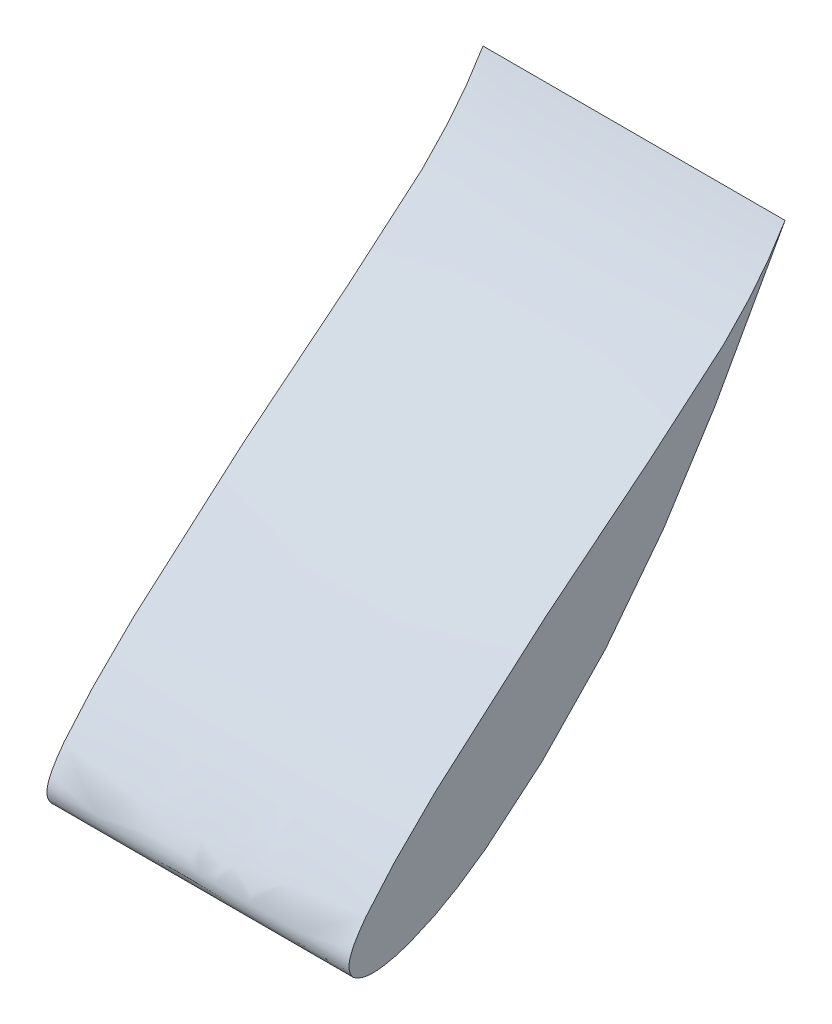
ISO-10303-21;
HEADER;
FILE_DESCRIPTION(('STEP AP214'),'2;1');
FILE_NAME('part.step','',(''),(''),'','','');
FILE_SCHEMA(('AUTOMOTIVE_DESIGN { 1 0 10303 214 1 1 1 1 }'));
ENDSEC;
DATA;
#1=APPLICATION_CONTEXT('core data for automotive mechanical design processes');
#2=APPLICATION_PROTOCOL_DEFINITION('international standard','automotive_design',2000,#1);
#3=PRODUCT_CONTEXT('',#1,'mechanical');
#4=PRODUCT('Part','Part','',(#3));
#5=PRODUCT_RELATED_PRODUCT_CATEGORY('part','',(#4));
#6=PRODUCT_DEFINITION_FORMATION('','',#4);
#7=PRODUCT_DEFINITION_CONTEXT('part definition',#1,'design');
#8=PRODUCT_DEFINITION('design','',#6,#7);
#9=PRODUCT_DEFINITION_SHAPE('','',#8);
#10=(LENGTH_UNIT() NAMED_UNIT(*) SI_UNIT(.MILLI.,.METRE.));
#11=(NAMED_UNIT(*) PLANE_ANGLE_UNIT() SI_UNIT($,.RADIAN.));
#12=(NAMED_UNIT(*) SI_UNIT($,.STERADIAN.) SOLID_ANGLE_UNIT());
#13=UNCERTAINTY_MEASURE_WITH_UNIT(LENGTH_MEASURE(1.E-05),#10,'distance_accuracy_value','');
#14=(GEOMETRIC_REPRESENTATION_CONTEXT(3) GLOBAL_UNCERTAINTY_ASSIGNED_CONTEXT((#13)) GLOBAL_UNIT_ASSIGNED_CONTEXT((#10,
#11,#12)) REPRESENTATION_CONTEXT('',''));
#15=CARTESIAN_POINT('',(0.,0.,0.));
#16=DIRECTION('',(0.,0.,1.));
#17=DIRECTION('',(1.,0.,0.));
#18=AXIS2_PLACEMENT_3D('',#15,#16,#17);
#19=CARTESIAN_POINT('',(127.,0.,0.));
#20=DIRECTION('',(1.,0.,0.));
#21=DIRECTION('',(0.,0.,-1.));
#22=AXIS2_PLACEMENT_3D('',#19,#20,#21);
#23=PLANE('',#22);
#24=CARTESIAN_POINT('',(127.,52.9354799084845,-40.4048691135743));
#25=CARTESIAN_POINT('',(127.,52.4137671791355,-40.1171040912825));
#26=CARTESIAN_POINT('',(127.,51.8905685831892,-39.8320779606717));
#27=CARTESIAN_POINT('',(127.,50.8427851251113,-39.2642197298081));
#28=CARTESIAN_POINT('',(127.,50.3181999087079,-38.9813882816529));
#29=CARTESIAN_POINT('',(127.,49.2694523013073,-38.4147551131644));
#30=CARTESIAN_POINT('',(127.,48.7452899841082,-38.1309532558409));
#31=CARTESIAN_POINT('',(127.,47.699220158,-37.5591676312307));
#32=CARTESIAN_POINT('',(127.,47.1773127322594,-37.2711837113742));
#33=CARTESIAN_POINT('',(127.,46.1349017641472,-36.6901365500034));
#34=CARTESIAN_POINT('',(127.,45.6144034418784,-36.3970639439042));
#35=CARTESIAN_POINT('',(127.,44.5761426285992,-35.8061908707564));
#36=CARTESIAN_POINT('',(127.,44.0583799559717,-35.508390722958));
#37=CARTESIAN_POINT('',(127.,43.0257851323046,-34.9078131349073));
#38=CARTESIAN_POINT('',(127.,42.510952819992,-34.6050359722025));
#39=CARTESIAN_POINT('',(127.,41.4849956086335,-33.9932456134951));
#40=CARTESIAN_POINT('',(127.,40.9738707175504,-33.6842324041039));
#41=CARTESIAN_POINT('',(127.,40.1336696469738,-33.1678314169927));
#42=CARTESIAN_POINT('',(127.,39.8032749919956,-32.9625890199827));
#43=CARTESIAN_POINT('',(127.,39.1446917717766,-32.5485956801728));
#44=CARTESIAN_POINT('',(127.,38.8165032070486,-32.3398447365574));
#45=CARTESIAN_POINT('',(127.,37.8355279951236,-31.7079754125323));
#46=CARTESIAN_POINT('',(127.,37.1863386907448,-31.2792447393812));
#47=CARTESIAN_POINT('',(127.,35.8986992061004,-30.405861784187));
#48=CARTESIAN_POINT('',(127.,35.2602497323682,-29.9612084606259));
#49=CARTESIAN_POINT('',(127.,33.9951650694955,-29.0549103838027));
#50=CARTESIAN_POINT('',(127.,33.368533809292,-28.5932601254433));
#51=CARTESIAN_POINT('',(127.,32.4392932031061,-27.8867549504141));
#52=CARTESIAN_POINT('',(127.,32.131334414735,-27.6489179210538));
#53=CARTESIAN_POINT('',(127.,31.5192627016928,-27.1683405039769));
#54=CARTESIAN_POINT('',(127.,31.2151497647494,-26.9256001319135));
#55=CARTESIAN_POINT('',(127.,30.6111562965156,-26.4349992042152));
#56=CARTESIAN_POINT('',(127.,30.3112751333758,-26.1871394268741));
#57=CARTESIAN_POINT('',(127.,29.7158628621185,-25.6862547377576));
#58=CARTESIAN_POINT('',(127.,29.420331739346,-25.43322984339));
#59=CARTESIAN_POINT('',(127.,28.6840324473075,-24.7920437085985));
#60=CARTESIAN_POINT('',(127.,28.2460041893548,-24.4007299705277));
#61=CARTESIAN_POINT('',(127.,27.379575500445,-23.6074883930336));
#62=CARTESIAN_POINT('',(127.,26.9511763378841,-23.2055591702735));
#63=CARTESIAN_POINT('',(127.,26.1038176077032,-22.3916555596206));
#64=CARTESIAN_POINT('',(127.,25.6848604624242,-21.979678649198));
#65=CARTESIAN_POINT('',(127.,24.8570206424302,-21.1454040079451));
#66=CARTESIAN_POINT('',(127.,24.4481418704578,-20.7231024012646));
#67=CARTESIAN_POINT('',(127.,23.6421147130366,-19.8690896634949));
#68=CARTESIAN_POINT('',(127.,23.2449438764818,-19.4373997321128));
#69=CARTESIAN_POINT('',(127.,22.4623198781587,-18.5636361319156));
#70=CARTESIAN_POINT('',(127.,22.0768648185578,-18.1215641656698));
#71=CARTESIAN_POINT('',(127.,21.3203157671264,-17.2256213509551));
#72=CARTESIAN_POINT('',(127.,20.9492145039348,-16.771756676542));
#73=CARTESIAN_POINT('',(127.,20.4052688240759,-16.0811189900447));
#74=CARTESIAN_POINT('',(127.,20.2261029665814,-15.8493096924968));
#75=CARTESIAN_POINT('',(127.,19.8723136756461,-15.3822536054008));
#76=CARTESIAN_POINT('',(127.,19.6976901325311,-15.1470068990636));
#77=CARTESIAN_POINT('',(127.,19.3418648654185,-14.6569986272377));
#78=CARTESIAN_POINT('',(127.,19.16100754148,-14.4019864838033));
#79=CARTESIAN_POINT('',(127.,18.8058739261573,-13.8874008968794));
#80=CARTESIAN_POINT('',(127.,18.6315977907662,-13.627827345485));
#81=CARTESIAN_POINT('',(127.,18.2902390469296,-13.1034038860101));
#82=CARTESIAN_POINT('',(127.,18.1231681454719,-12.8385463433392));
#83=CARTESIAN_POINT('',(127.,17.7976489134046,-12.3035805580017));
#84=CARTESIAN_POINT('',(127.,17.6392001124003,-12.0334726028743));
#85=CARTESIAN_POINT('',(127.,17.3738012548588,-11.5611517336116));
#86=CARTESIAN_POINT('',(127.,17.264484500117,-11.3602683645601));
#87=CARTESIAN_POINT('',(127.,17.0518507431628,-10.955322403647));
#88=CARTESIAN_POINT('',(127.,16.9485342237639,-10.7512595576174));
#89=CARTESIAN_POINT('',(127.,16.7485097381034,-10.3398320265659));
#90=CARTESIAN_POINT('',(127.,16.6518038877443,-10.1324663103248));
#91=CARTESIAN_POINT('',(127.,16.4661625518936,-9.71524404246948));
#92=CARTESIAN_POINT('',(127.,16.3771982927663,-9.50540032409532));
#93=CARTESIAN_POINT('',(127.,16.2073909281171,-9.08249140577542));
#94=CARTESIAN_POINT('',(127.,16.1265460475538,-8.86942692171647));
#95=CARTESIAN_POINT('',(127.,15.9749599514898,-8.43980850077858));
#96=CARTESIAN_POINT('',(127.,15.9042135318972,-8.22325642567628));
#97=CARTESIAN_POINT('',(127.,15.803487440203,-7.88325776805525));
#98=CARTESIAN_POINT('',(127.,15.7693276117809,-7.76104374168783));
#99=CARTESIAN_POINT('',(127.,15.7052743041999,-7.5155096415678));
#100=CARTESIAN_POINT('',(127.,15.6753803528004,-7.3921896918519));
#101=CARTESIAN_POINT('',(127.,15.6202682791367,-7.14379287464377));
#102=CARTESIAN_POINT('',(127.,15.595076514477,-7.01871009598277));
#103=CARTESIAN_POINT('',(127.,15.5613623209063,-6.83035160151436));
#104=CARTESIAN_POINT('',(127.,15.5508022702029,-6.76743640261901));
#105=CARTESIAN_POINT('',(127.,15.5311157184798,-6.64137968066058));
#106=CARTESIAN_POINT('',(127.,15.5219892533437,-6.57823815197277));
#107=CARTESIAN_POINT('',(127.,15.5050844398135,-6.45080984079273));
#108=CARTESIAN_POINT('',(127.,15.4973283467251,-6.38652007715653));
#109=CARTESIAN_POINT('',(127.,15.483529679713,-6.25775989510922));
#110=CARTESIAN_POINT('',(127.,15.4774870986416,-6.19328947745283));
#111=CARTESIAN_POINT('',(127.,15.4625630744186,-5.9995544708488));
#112=CARTESIAN_POINT('',(127.,15.456890724083,-5.87000341705056));
#113=CARTESIAN_POINT('',(127.,15.4575232936991,-5.61190323573034));
#114=CARTESIAN_POINT('',(127.,15.4637307328689,-5.48335457034015));
#115=CARTESIAN_POINT('',(127.,15.4915324434722,-5.2279610093112));
#116=CARTESIAN_POINT('',(127.,15.5130983283935,-5.10111340966122));
#117=CARTESIAN_POINT('',(127.,15.5598297764874,-4.91151294310078));
#118=CARTESIAN_POINT('',(127.,15.5783515771193,-4.84709518949134));
#119=CARTESIAN_POINT('',(127.,15.6206103401318,-4.72000381889216));
#120=CARTESIAN_POINT('',(127.,15.6443451894758,-4.65732950678613));
#121=CARTESIAN_POINT('',(127.,15.6970921256147,-4.5342825032402));
#122=CARTESIAN_POINT('',(127.,15.726101307542,-4.47390856688565));
#123=CARTESIAN_POINT('',(127.,15.7892667023141,-4.35594521441585));
#124=CARTESIAN_POINT('',(127.,15.8234201277958,-4.2983543125234));
#125=CARTESIAN_POINT('',(127.,15.8755215818302,-4.21855545338712));
#126=CARTESIAN_POINT('',(127.,15.8914983790592,-4.19503976298629));
#127=CARTESIAN_POINT('',(127.,15.9242717432839,-4.14862809669387));
#128=CARTESIAN_POINT('',(127.,15.9410673233121,-4.12573142399801));
#129=CARTESIAN_POINT('',(127.,15.9582662090284,-4.10313794384454));
#130=B_SPLINE_CURVE_WITH_KNOTS('',3,(#24,#25,#26,#27,#28,#29,#30,#31,#32,#33,#34,#35,#36,#37,
#38,#39,#40,#41,#42,#43,#44,#45,#46,#47,#48,#49,#50,#51,#52,#53,#54,#55,#56,#57,#58,#59,#60,#61,
#62,#63,#64,#65,#66,#67,#68,#69,#70,#71,#72,#73,#74,#75,#76,#77,#78,#79,#80,#81,#82,#83,#84,#85,
#86,#87,#88,#89,#90,#91,#92,#93,#94,#95,#96,#97,#98,#99,#100,#101,#102,#103,#104,#105,#106,#107,
#108,#109,#110,#111,#112,#113,#114,#115,#116,#117,#118,#119,#120,#121,#122,#123,#124,#125,#126,
#127,#128,#129),.UNSPECIFIED.,.F.,.F.,(4,2,2,2,2,2,2,2,2,2,2,2,2,2,2,2,2,2,2,2,2,2,2,2,2,2,2,2,
2,2,2,2,2,2,2,2,2,2,2,2,2,2,2,2,2,2,2,2,2,2,2,2,4),(0.,1.78740243977629,3.57531705557926,
5.36349544589948,7.15173923712453,8.94372357059277,10.7355874021178,12.5273516455866,
14.3191197363257,15.4859609606994,16.6528024563051,18.9865095750841,21.3203696240367,
23.6549923485911,24.8222751687315,25.9895542630454,27.1566571855261,28.3237561751954,
30.085650671028,31.8477759088055,33.6103481872038,35.3735926081489,37.1332009491542,
38.8925227163522,40.6509412493886,41.5298284845889,42.4086944792972,43.3465099154335,
44.2843475665447,45.2236556329639,46.1629124022302,46.8489276883782,47.5349980990169,
48.2212870845369,48.9049054007065,49.5883739388531,50.2714889801108,50.6521213426216,
51.0327115356747,51.415374911224,51.6067468013727,51.7981234809251,51.9923684624184,
52.1866126336311,52.5752138252954,52.960639978238,53.3453556032924,53.5462461702155,
53.7470554587291,53.9477544836064,54.1483451501024,54.2336191558244,54.3187927974775),.UNSPECIFIED.);
#131=CARTESIAN_POINT('',(127.,52.9354799084845,-40.4048691135743));
#132=VERTEX_POINT('',#131);
#133=CARTESIAN_POINT('',(127.,15.9582662090284,-4.10313794384453));
#134=VERTEX_POINT('',#133);
#135=EDGE_CURVE('E72',#132,#134,#130,.T.);
#136=ORIENTED_EDGE('',*,*,#135,.T.);
#137=CARTESIAN_POINT('',(127.,15.9582662090284,-4.10313794384453));
#138=CARTESIAN_POINT('',(127.,15.9897020153265,-4.07603525395708));
#139=CARTESIAN_POINT('',(127.,16.0220898486521,-4.0500045823344));
#140=CARTESIAN_POINT('',(127.,16.088758965993,-4.00041472982733));
#141=CARTESIAN_POINT('',(127.,16.1230423692148,-3.97685840411641));
#142=CARTESIAN_POINT('',(127.,16.1934066459634,-3.93261662088422));
#143=CARTESIAN_POINT('',(127.,16.2294868306572,-3.91193007451456));
#144=CARTESIAN_POINT('',(127.,16.3032888141041,-3.87375793683359));
#145=CARTESIAN_POINT('',(127.,16.3410099427409,-3.85627105377781));
#146=CARTESIAN_POINT('',(127.,16.4181180860555,-3.82465223698162));
#147=CARTESIAN_POINT('',(127.,16.4575141941895,-3.81054242117914));
#148=CARTESIAN_POINT('',(127.,16.5374440963456,-3.78597966585558));
#149=CARTESIAN_POINT('',(127.,16.5779782608615,-3.77552793248891));
#150=CARTESIAN_POINT('',(127.,16.6597137211296,-3.75833661457214));
#151=CARTESIAN_POINT('',(127.,16.700913020002,-3.75158749775357));
#152=CARTESIAN_POINT('',(127.,16.7837553225198,-3.74164969487142));
#153=CARTESIAN_POINT('',(127.,16.8253985706178,-3.73846308481202));
#154=CARTESIAN_POINT('',(127.,16.9196325297598,-3.73505105130766));
#155=CARTESIAN_POINT('',(127.,16.9722589612056,-3.73580902337426));
#156=CARTESIAN_POINT('',(127.,17.0772349312939,-3.74205961557342));
#157=CARTESIAN_POINT('',(127.,17.1295843040043,-3.74755480728057));
#158=CARTESIAN_POINT('',(127.,17.2338893525762,-3.76264945874386));
#159=CARTESIAN_POINT('',(127.,17.2858425743016,-3.77226545563157));
#160=CARTESIAN_POINT('',(127.,17.3889761189363,-3.79495397219696));
#161=CARTESIAN_POINT('',(127.,17.4401564231461,-3.80802657536014));
#162=CARTESIAN_POINT('',(127.,17.6280926366016,-3.86167627107468));
#163=CARTESIAN_POINT('',(127.,17.762256933202,-3.9112006896556));
#164=CARTESIAN_POINT('',(127.,18.0258898005196,-4.02150722359051));
#165=CARTESIAN_POINT('',(127.,18.1553477224129,-4.08231317332766));
#166=CARTESIAN_POINT('',(127.,18.4104908166608,-4.21314295467164));
#167=CARTESIAN_POINT('',(127.,18.5361494670511,-4.28321866374612));
#168=CARTESIAN_POINT('',(127.,18.7216179624025,-4.39314814951063));
#169=CARTESIAN_POINT('',(127.,18.782904896554,-4.43057221252002));
#170=CARTESIAN_POINT('',(127.,18.9046446756029,-4.5067605939014));
#171=CARTESIAN_POINT('',(127.,18.9650975011347,-4.54552494331789));
#172=CARTESIAN_POINT('',(127.,19.0915533446066,-4.62815368486168));
#173=CARTESIAN_POINT('',(127.,19.1574826365996,-4.67213043222207));
#174=CARTESIAN_POINT('',(127.,19.2885983606874,-4.76117890936404));
#175=CARTESIAN_POINT('',(127.,19.3537847798157,-4.80625065821552));
#176=CARTESIAN_POINT('',(127.,19.5482524380216,-4.94303182885625));
#177=CARTESIAN_POINT('',(127.,19.6764375859548,-5.03630422613201));
#178=CARTESIAN_POINT('',(127.,19.9302829474789,-5.22657897441652));
#179=CARTESIAN_POINT('',(127.,20.055939306028,-5.32358644726971));
#180=CARTESIAN_POINT('',(127.,20.3048060327779,-5.52067647918248));
#181=CARTESIAN_POINT('',(127.,20.4280164576427,-5.62075896686732));
#182=CARTESIAN_POINT('',(127.,20.6726718998121,-5.82350094372305));
#183=CARTESIAN_POINT('',(127.,20.7941132649097,-5.92616482250584));
#184=CARTESIAN_POINT('',(127.,21.0355349737598,-6.13319472361453));
#185=CARTESIAN_POINT('',(127.,21.1555152926519,-6.23756077483298));
#186=CARTESIAN_POINT('',(127.,21.3944207651482,-6.44755720230344));
#187=CARTESIAN_POINT('',(127.,21.5133456245174,-6.55318791295519));
#188=CARTESIAN_POINT('',(127.,21.7501165953424,-6.76564712418052));
#189=CARTESIAN_POINT('',(127.,21.8679627238867,-6.87247560571991));
#190=CARTESIAN_POINT('',(127.,22.2200410424891,-7.19464217325941));
#191=CARTESIAN_POINT('',(127.,22.4527708435807,-7.41162408248924));
#192=CARTESIAN_POINT('',(127.,22.9144409520821,-7.84894306040462));
#193=CARTESIAN_POINT('',(127.,23.1433860228825,-8.06927511449414));
#194=CARTESIAN_POINT('',(127.,23.5981413894061,-8.51281311510971));
#195=CARTESIAN_POINT('',(127.,23.8239538805466,-8.73601681309504));
#196=CARTESIAN_POINT('',(127.,24.2729612176661,-9.18494952179519));
#197=CARTESIAN_POINT('',(127.,24.496156572631,-9.41067802421813));
#198=CARTESIAN_POINT('',(127.,24.9383265151574,-9.862016319281));
#199=CARTESIAN_POINT('',(127.,25.1573210542562,-10.0876065843879));
#200=CARTESIAN_POINT('',(127.,25.5933965697726,-10.5406298049737));
#201=CARTESIAN_POINT('',(127.,25.8104775378342,-10.7680627684908));
#202=CARTESIAN_POINT('',(127.,26.4589161881908,-11.4530302659432));
#203=CARTESIAN_POINT('',(127.,26.8874649213273,-11.9132286072605));
#204=CARTESIAN_POINT('',(127.,27.7377942848939,-12.8403556724227));
#205=CARTESIAN_POINT('',(127.,28.159570521526,-13.3072884199004));
#206=CARTESIAN_POINT('',(127.,28.9966659869871,-14.2468967008421));
#207=CARTESIAN_POINT('',(127.,29.4119852369859,-14.7195722154689));
#208=CARTESIAN_POINT('',(127.,30.0309625174644,-15.4313203860787));
#209=CARTESIAN_POINT('',(127.,30.2364419650822,-15.6688150312192));
#210=CARTESIAN_POINT('',(127.,30.6463867745242,-16.144678390849));
#211=CARTESIAN_POINT('',(127.,30.8508521362834,-16.3830471053944));
#212=CARTESIAN_POINT('',(127.,31.2589627460663,-16.860486694873));
#213=CARTESIAN_POINT('',(127.,31.4626079904695,-17.0995575728981));
#214=CARTESIAN_POINT('',(127.,31.8693010109142,-17.5782068512092));
#215=CARTESIAN_POINT('',(127.,32.0723487869112,-17.8177852515331));
#216=CARTESIAN_POINT('',(127.,32.4778429405039,-18.2973939206319));
#217=CARTESIAN_POINT('',(127.,32.6802893971373,-18.5374241225704));
#218=CARTESIAN_POINT('',(127.,33.0845611164748,-19.0180068168426));
#219=CARTESIAN_POINT('',(127.,33.2863863794102,-19.2585593089819));
#220=CARTESIAN_POINT('',(127.,33.8908879340611,-19.9810259660136));
#221=CARTESIAN_POINT('',(127.,34.2925934505231,-20.463753400526));
#222=CARTESIAN_POINT('',(127.,35.0466649777742,-21.3754641190009));
#223=CARTESIAN_POINT('',(127.,35.3993482076225,-21.8041850627274));
#224=CARTESIAN_POINT('',(127.,36.1024314376241,-22.6635053589447));
#225=CARTESIAN_POINT('',(127.,36.4528314042789,-23.0941047388408));
#226=CARTESIAN_POINT('',(127.,37.1514521900473,-23.9570055350802));
#227=CARTESIAN_POINT('',(127.,37.4996731958122,-24.3893068003239));
#228=CARTESIAN_POINT('',(127.,38.0204454972158,-25.0389392956427));
#229=CARTESIAN_POINT('',(127.,38.1937598105646,-25.2556593368172));
#230=CARTESIAN_POINT('',(127.,38.5398849019516,-25.6895011779121));
#231=CARTESIAN_POINT('',(127.,38.7126956799862,-25.9066229778354));
#232=CARTESIAN_POINT('',(127.,39.2299570390854,-26.55762809668));
#233=CARTESIAN_POINT('',(127.,39.5738677075765,-26.9919399658272));
#234=CARTESIAN_POINT('',(127.,40.2615370429286,-27.8607104619774));
#235=CARTESIAN_POINT('',(127.,40.6052957035386,-28.2951690939162));
#236=CARTESIAN_POINT('',(127.,41.1218395891775,-28.9462702074575));
#237=CARTESIAN_POINT('',(127.,41.2942039020156,-29.163246272632));
#238=CARTESIAN_POINT('',(127.,41.6393460538216,-29.5968699893594));
#239=CARTESIAN_POINT('',(127.,41.8121238935296,-29.8135176403236));
#240=CARTESIAN_POINT('',(127.,42.1585338805115,-30.2463932599833));
#241=CARTESIAN_POINT('',(127.,42.3321665658937,-30.4626207988171));
#242=CARTESIAN_POINT('',(127.,42.6806089210619,-30.894124608844));
#243=CARTESIAN_POINT('',(127.,42.8554185868518,-31.1094008832627));
#244=CARTESIAN_POINT('',(127.,43.3148503210101,-31.6709171206286));
#245=CARTESIAN_POINT('',(127.,43.6007580308088,-32.0161094894614));
#246=CARTESIAN_POINT('',(127.,44.1784642732131,-32.7015366365363));
#247=CARTESIAN_POINT('',(127.,44.4702627076567,-33.041771497227));
#248=CARTESIAN_POINT('',(127.,45.0612003142758,-33.7153877684065));
#249=CARTESIAN_POINT('',(127.,45.3603339625834,-34.0487740084837));
#250=CARTESIAN_POINT('',(127.,45.9672075562925,-34.7069595453716));
#251=CARTESIAN_POINT('',(127.,46.2749375648163,-35.0317679758948));
#252=CARTESIAN_POINT('',(127.,46.9002216530853,-35.6711102804522));
#253=CARTESIAN_POINT('',(127.,47.2177644098849,-35.985655194565));
#254=CARTESIAN_POINT('',(127.,47.8672026080074,-36.6059138507558));
#255=CARTESIAN_POINT('',(127.,48.1992058657072,-36.9115150879275));
#256=CARTESIAN_POINT('',(127.,48.875813578886,-37.5087170241964));
#257=CARTESIAN_POINT('',(127.,49.2204222933871,-37.8003129128636));
#258=CARTESIAN_POINT('',(127.,49.9233411173098,-38.368002038349));
#259=CARTESIAN_POINT('',(127.,50.2816770487136,-38.6440633770217));
#260=CARTESIAN_POINT('',(127.,51.0132676702634,-39.1790900724512));
#261=CARTESIAN_POINT('',(127.,51.3865788373366,-39.4379785293278));
#262=CARTESIAN_POINT('',(127.,52.1494061517535,-39.9368521995793));
#263=CARTESIAN_POINT('',(127.,52.5390187454871,-40.1766897148504));
#264=CARTESIAN_POINT('',(127.,52.9354799084845,-40.4048691135743));
#265=B_SPLINE_CURVE_WITH_KNOTS('',3,(#137,#138,#139,#140,#141,#142,#143,#144,#145,#146,#147,
#148,#149,#150,#151,#152,#153,#154,#155,#156,#157,#158,#159,#160,#161,#162,#163,#164,#165,#166,
#167,#168,#169,#170,#171,#172,#173,#174,#175,#176,#177,#178,#179,#180,#181,#182,#183,#184,#185,
#186,#187,#188,#189,#190,#191,#192,#193,#194,#195,#196,#197,#198,#199,#200,#201,#202,#203,#204,
#205,#206,#207,#208,#209,#210,#211,#212,#213,#214,#215,#216,#217,#218,#219,#220,#221,#222,#223,
#224,#225,#226,#227,#228,#229,#230,#231,#232,#233,#234,#235,#236,#237,#238,#239,#240,#241,#242,
#243,#244,#245,#246,#247,#248,#249,#250,#251,#252,#253,#254,#255,#256,#257,#258,#259,#260,#261,
#262,#263,#264),.UNSPECIFIED.,.F.,.F.,(4,2,2,2,2,2,2,2,2,2,2,2,2,2,2,2,2,2,2,2,2,2,2,2,2,2,2,2,
2,2,2,2,2,2,2,2,2,2,2,2,2,2,2,2,2,2,2,2,2,2,2,2,2,2,2,2,2,2,2,2,2,2,2,4),(0.,0.124525638798844,
0.249193425987642,0.373813781735838,0.49838371513069,0.623748459297297,0.749154500264918,
0.874236153911115,0.999390659321068,1.15703307612721,1.31476112221022,1.47312816039387,
1.6314990238784,2.05938490252892,2.48818528376902,2.91949585061907,3.13491594576407,
3.35034103394194,3.58808070570793,3.8258245207778,4.30132826283243,4.77750905713624,
5.25367880705515,5.73072185751115,6.20777301370544,6.68495322658595,7.16212586715182,
8.11664035826162,9.0698445611249,10.0223430335058,10.9746530826601,11.9178517317097,
12.8610544973792,14.7474801690209,16.635083909293,18.5226814595846,19.4648206317879,
20.4069598644062,21.3491032517494,22.2912467091483,23.2332603035669,24.1752735473715,
26.0592839679469,27.7247142099004,29.3901688312355,31.0554787799222,31.8879737129979,
32.7204686520589,34.3824279665289,36.0444502326351,36.8757696259672,37.707090507876,
38.5390273087782,39.3709612865357,40.715573182719,42.0601626909942,43.4037689818458,
44.7458816486311,46.0864995800836,47.4398733925079,48.7937087731161,50.1502296014306,
51.5124636774838,52.8843958238453),.UNSPECIFIED.);
#266=EDGE_CURVE('E41',#134,#132,#265,.T.);
#267=ORIENTED_EDGE('',*,*,#266,.T.);
#268=EDGE_LOOP('',(#136,#267));
#269=FACE_BOUND('',#268,.T.);
#270=ADVANCED_FACE('F34',(#269),#23,.F.);
#271=CARTESIAN_POINT('',(152.4,0.,0.));
#272=DIRECTION('',(1.,0.,0.));
#273=DIRECTION('',(0.,0.,-1.));
#274=AXIS2_PLACEMENT_3D('',#271,#272,#273);
#275=PLANE('',#274);
#276=CARTESIAN_POINT('',(152.4,52.9354799084845,-40.4048691135743));
#277=CARTESIAN_POINT('',(152.4,52.413767179135,-40.1171040912823));
#278=CARTESIAN_POINT('',(152.4,51.8905685831883,-39.8320779606712));
#279=CARTESIAN_POINT('',(152.4,50.8427851251095,-39.2642197298071));
#280=CARTESIAN_POINT('',(152.4,50.3181999087056,-38.9813882816517));
#281=CARTESIAN_POINT('',(152.4,49.2694523013041,-38.4147551131627));
#282=CARTESIAN_POINT('',(152.4,48.7452899841046,-38.130953255839));
#283=CARTESIAN_POINT('',(152.4,47.6992201579955,-37.5591676312282));
#284=CARTESIAN_POINT('',(152.4,47.1773127322544,-37.2711837113715));
#285=CARTESIAN_POINT('',(152.4,46.1349017641414,-36.6901365500001));
#286=CARTESIAN_POINT('',(152.4,45.6144034418721,-36.3970639439007));
#287=CARTESIAN_POINT('',(152.4,44.5761426285921,-35.8061908707524));
#288=CARTESIAN_POINT('',(152.4,44.0583799559641,-35.5083907229536));
#289=CARTESIAN_POINT('',(152.4,43.0257851322962,-34.9078131349023));
#290=CARTESIAN_POINT('',(152.4,42.5109528199832,-34.6050359721973));
#291=CARTESIAN_POINT('',(152.4,41.4849956086238,-33.9932456134893));
#292=CARTESIAN_POINT('',(152.4,40.9738707175403,-33.6842324040978));
#293=CARTESIAN_POINT('',(152.4,40.1336696469636,-33.1678314169863));
#294=CARTESIAN_POINT('',(152.4,39.8032749919856,-32.9625890199764));
#295=CARTESIAN_POINT('',(152.4,39.1446917717671,-32.5485956801668));
#296=CARTESIAN_POINT('',(152.4,38.8165032070394,-32.3398447365514));
#297=CARTESIAN_POINT('',(152.4,37.8355279951151,-31.7079754125268));
#298=CARTESIAN_POINT('',(152.4,37.1863386907368,-31.2792447393759));
#299=CARTESIAN_POINT('',(152.4,35.8986992060933,-30.4058617841821));
#300=CARTESIAN_POINT('',(152.4,35.2602497323616,-29.9612084606213));
#301=CARTESIAN_POINT('',(152.4,33.9951650694899,-29.0549103837987));
#302=CARTESIAN_POINT('',(152.4,33.3685338092869,-28.5932601254395));
#303=CARTESIAN_POINT('',(152.4,32.4392932031017,-27.8867549504107));
#304=CARTESIAN_POINT('',(152.4,32.1313344147308,-27.6489179210506));
#305=CARTESIAN_POINT('',(152.4,31.5192627016891,-27.1683405039739));
#306=CARTESIAN_POINT('',(152.4,31.2151497647459,-26.9256001319107));
#307=CARTESIAN_POINT('',(152.4,30.6111562965125,-26.4349992042127));
#308=CARTESIAN_POINT('',(152.4,30.3112751333729,-26.1871394268718));
#309=CARTESIAN_POINT('',(152.4,29.7158628621161,-25.6862547377556));
#310=CARTESIAN_POINT('',(152.4,29.4203317393438,-25.4332298433881));
#311=CARTESIAN_POINT('',(152.4,28.6840324473059,-24.7920437085971));
#312=CARTESIAN_POINT('',(152.4,28.2460041893535,-24.4007299705265));
#313=CARTESIAN_POINT('',(152.4,27.3795755004443,-23.6074883930329));
#314=CARTESIAN_POINT('',(152.4,26.9511763378836,-23.2055591702731));
#315=CARTESIAN_POINT('',(152.4,26.1038176077034,-22.3916555596208));
#316=CARTESIAN_POINT('',(152.4,25.6848604624246,-21.9796786491984));
#317=CARTESIAN_POINT('',(152.4,24.8570206424311,-21.1454040079461));
#318=CARTESIAN_POINT('',(152.4,24.448141870459,-20.7231024012659));
#319=CARTESIAN_POINT('',(152.4,23.6421147130383,-19.8690896634968));
#320=CARTESIAN_POINT('',(152.4,23.2449438764838,-19.437399732115));
#321=CARTESIAN_POINT('',(152.4,22.4623198781611,-18.5636361319184));
#322=CARTESIAN_POINT('',(152.4,22.0768648185605,-18.1215641656729));
#323=CARTESIAN_POINT('',(152.4,21.3203157671295,-17.2256213509588));
#324=CARTESIAN_POINT('',(152.4,20.9492145039381,-16.7717566765461));
#325=CARTESIAN_POINT('',(152.4,20.4052688240795,-16.0811189900493));
#326=CARTESIAN_POINT('',(152.4,20.226102966585,-15.8493096925016));
#327=CARTESIAN_POINT('',(152.4,19.87231367565,-15.382253605406));
#328=CARTESIAN_POINT('',(152.4,19.697690132535,-15.147006899069));
#329=CARTESIAN_POINT('',(152.4,19.3418648654224,-14.6569986272432));
#330=CARTESIAN_POINT('',(152.4,19.1610075414837,-14.4019864838087));
#331=CARTESIAN_POINT('',(152.4,18.8058739261608,-13.8874008968846));
#332=CARTESIAN_POINT('',(152.4,18.6315977907695,-13.62782734549));
#333=CARTESIAN_POINT('',(152.4,18.2902390469326,-13.1034038860149));
#334=CARTESIAN_POINT('',(152.4,18.1231681454749,-12.8385463433439));
#335=CARTESIAN_POINT('',(152.4,17.7976489134072,-12.3035805580062));
#336=CARTESIAN_POINT('',(152.4,17.6392001124029,-12.0334726028787));
#337=CARTESIAN_POINT('',(152.4,17.3738012548611,-11.5611517336159));
#338=CARTESIAN_POINT('',(152.4,17.2644845001192,-11.3602683645643));
#339=CARTESIAN_POINT('',(152.4,17.0518507431649,-10.9553224036512));
#340=CARTESIAN_POINT('',(152.4,16.948534223766,-10.7512595576215));
#341=CARTESIAN_POINT('',(152.4,16.7485097381053,-10.33983202657));
#342=CARTESIAN_POINT('',(152.4,16.6518038877462,-10.1324663103288));
#343=CARTESIAN_POINT('',(152.4,16.4661625518953,-9.71524404247343));
#344=CARTESIAN_POINT('',(152.4,16.3771982927679,-9.50540032409924));
#345=CARTESIAN_POINT('',(152.4,16.2073909281185,-9.08249140577927));
#346=CARTESIAN_POINT('',(152.4,16.1265460475551,-8.86942692172027));
#347=CARTESIAN_POINT('',(152.4,15.974959951491,-8.4398085007823));
#348=CARTESIAN_POINT('',(152.4,15.9042135318983,-8.22325642567997));
#349=CARTESIAN_POINT('',(152.4,15.803487440204,-7.88325776805882));
#350=CARTESIAN_POINT('',(152.4,15.7693276117818,-7.76104374169134));
#351=CARTESIAN_POINT('',(152.4,15.7052743042007,-7.51550964157117));
#352=CARTESIAN_POINT('',(152.4,15.6753803528012,-7.3921896918552));
#353=CARTESIAN_POINT('',(152.4,15.6202682791373,-7.14379287464693));
#354=CARTESIAN_POINT('',(152.4,15.5950765144776,-7.01871009598585));
#355=CARTESIAN_POINT('',(152.4,15.5613623209068,-6.83035160151733));
#356=CARTESIAN_POINT('',(152.4,15.5508022702033,-6.76743640262194));
#357=CARTESIAN_POINT('',(152.4,15.5311157184802,-6.64137968066344));
#358=CARTESIAN_POINT('',(152.4,15.5219892533441,-6.57823815197559));
#359=CARTESIAN_POINT('',(152.4,15.5050844398138,-6.45080984079547));
#360=CARTESIAN_POINT('',(152.4,15.4973283467254,-6.38652007715924));
#361=CARTESIAN_POINT('',(152.4,15.4835296797132,-6.25775989511186));
#362=CARTESIAN_POINT('',(152.4,15.4774870986418,-6.19328947745543));
#363=CARTESIAN_POINT('',(152.4,15.4625630744187,-5.99955447085129));
#364=CARTESIAN_POINT('',(152.4,15.456890724083,-5.87000341705297));
#365=CARTESIAN_POINT('',(152.4,15.457523293699,-5.6119032357326));
#366=CARTESIAN_POINT('',(152.4,15.4637307328687,-5.48335457034233));
#367=CARTESIAN_POINT('',(152.4,15.4915324434719,-5.2279610093132));
#368=CARTESIAN_POINT('',(152.4,15.5130983283931,-5.10111340966313));
#369=CARTESIAN_POINT('',(152.4,15.5598297764869,-4.91151294310258));
#370=CARTESIAN_POINT('',(152.4,15.5783515771187,-4.84709518949311));
#371=CARTESIAN_POINT('',(152.4,15.6206103401311,-4.72000381889389));
#372=CARTESIAN_POINT('',(152.4,15.644345189475,-4.65732950678783));
#373=CARTESIAN_POINT('',(152.4,15.697092125614,-4.53428250324185));
#374=CARTESIAN_POINT('',(152.4,15.7261013075412,-4.47390856688727));
#375=CARTESIAN_POINT('',(152.4,15.7892667023132,-4.35594521441741));
#376=CARTESIAN_POINT('',(152.4,15.8234201277949,-4.29835431252493));
#377=CARTESIAN_POINT('',(152.4,15.8755215818294,-4.21855545338835));
#378=CARTESIAN_POINT('',(152.4,15.8914983790585,-4.19503976298728));
#379=CARTESIAN_POINT('',(152.4,15.9242717432835,-4.14862809669436));
#380=CARTESIAN_POINT('',(152.4,15.9410673233119,-4.12573142399825));
#381=CARTESIAN_POINT('',(152.4,15.9582662090284,-4.10313794384454));
#382=B_SPLINE_CURVE_WITH_KNOTS('',3,(#276,#277,#278,#279,#280,#281,#282,#283,#284,#285,#286,
#287,#288,#289,#290,#291,#292,#293,#294,#295,#296,#297,#298,#299,#300,#301,#302,#303,#304,#305,
#306,#307,#308,#309,#310,#311,#312,#313,#314,#315,#316,#317,#318,#319,#320,#321,#322,#323,#324,
#325,#326,#327,#328,#329,#330,#331,#332,#333,#334,#335,#336,#337,#338,#339,#340,#341,#342,#343,
#344,#345,#346,#347,#348,#349,#350,#351,#352,#353,#354,#355,#356,#357,#358,#359,#360,#361,#362,
#363,#364,#365,#366,#367,#368,#369,#370,#371,#372,#373,#374,#375,#376,#377,#378,#379,#380,#381),
.UNSPECIFIED.,.F.,.F.,(4,2,2,2,2,2,2,2,2,2,2,2,2,2,2,2,2,2,2,2,2,2,2,2,2,2,2,2,2,2,2,2,2,2,2,2,
2,2,2,2,2,2,2,2,2,2,2,2,2,2,2,2,4),(0.,1.78740243977782,3.57531705558233,5.36349544590408,
7.15173923713066,8.94372357060045,10.735587402127,12.5273516455974,14.319119736338,
15.4859609607108,16.6528024563158,18.9865095750931,21.3203696240441,23.6549923485969,
24.8222751687364,25.9895542630496,27.1566571855294,28.3237561751979,30.0856506710293,
31.8477759088057,33.6103481872028,35.3735926081467,37.1332009491508,38.8925227163477,
40.6509412493829,41.5298284845826,42.4086944792903,43.3465099154271,44.2843475665387,
45.2236556329585,46.1629124022252,46.8489276883735,47.5349980990123,48.2212870845325,
48.9049054007023,49.5883739388491,50.271488980107,50.652121342618,51.0327115356714,
51.4153749112209,51.6067468013698,51.7981234809223,51.9923684624157,52.1866126336286,
52.5752138252931,52.9606399782359,53.3453556032905,53.5462461702136,53.7470554587272,
53.9477544836046,54.1483451501007,54.2336191558236,54.3187927974775),.UNSPECIFIED.);
#383=CARTESIAN_POINT('',(152.4,52.9354799084844,-40.4048691135743));
#384=VERTEX_POINT('',#383);
#385=CARTESIAN_POINT('',(152.4,15.9582662090284,-4.10313794384453));
#386=VERTEX_POINT('',#385);
#387=EDGE_CURVE('E74',#384,#386,#382,.T.);
#388=ORIENTED_EDGE('',*,*,#387,.F.);
#389=CARTESIAN_POINT('',(152.4,15.9582662090284,-4.10313794384453));
#390=CARTESIAN_POINT('',(152.4,15.9897020153265,-4.07603525395709));
#391=CARTESIAN_POINT('',(152.4,16.0220898486521,-4.0500045823344));
#392=CARTESIAN_POINT('',(152.4,16.088758965993,-4.00041472982734));
#393=CARTESIAN_POINT('',(152.4,16.1230423692148,-3.97685840411642));
#394=CARTESIAN_POINT('',(152.4,16.1934066459634,-3.93261662088423));
#395=CARTESIAN_POINT('',(152.4,16.2294868306572,-3.91193007451457));
#396=CARTESIAN_POINT('',(152.4,16.303288814104,-3.8737579368336));
#397=CARTESIAN_POINT('',(152.4,16.3410099427408,-3.85627105377782));
#398=CARTESIAN_POINT('',(152.4,16.4181180860554,-3.82465223698163));
#399=CARTESIAN_POINT('',(152.4,16.4575141941894,-3.81054242117915));
#400=CARTESIAN_POINT('',(152.4,16.5374440963455,-3.7859796658556));
#401=CARTESIAN_POINT('',(152.4,16.5779782608614,-3.77552793248892));
#402=CARTESIAN_POINT('',(152.4,16.6597137211295,-3.75833661457215));
#403=CARTESIAN_POINT('',(152.4,16.7009130200019,-3.75158749775357));
#404=CARTESIAN_POINT('',(152.4,16.7837553225197,-3.74164969487142));
#405=CARTESIAN_POINT('',(152.4,16.8253985706177,-3.73846308481202));
#406=CARTESIAN_POINT('',(152.4,16.9196325297597,-3.73505105130766));
#407=CARTESIAN_POINT('',(152.4,16.9722589612055,-3.73580902337426));
#408=CARTESIAN_POINT('',(152.4,17.0772349312938,-3.7420596155734));
#409=CARTESIAN_POINT('',(152.4,17.1295843040042,-3.74755480728055));
#410=CARTESIAN_POINT('',(152.4,17.2338893525761,-3.76264945874384));
#411=CARTESIAN_POINT('',(152.4,17.2858425743015,-3.77226545563154));
#412=CARTESIAN_POINT('',(152.4,17.3889761189361,-3.79495397219692));
#413=CARTESIAN_POINT('',(152.4,17.440156423146,-3.8080265753601));
#414=CARTESIAN_POINT('',(152.4,17.6280926366014,-3.86167627107462));
#415=CARTESIAN_POINT('',(152.4,17.7622569332018,-3.91120068965553));
#416=CARTESIAN_POINT('',(152.4,18.0258898005194,-4.02150722359042));
#417=CARTESIAN_POINT('',(152.4,18.1553477224126,-4.08231317332756));
#418=CARTESIAN_POINT('',(152.4,18.4104908166605,-4.21314295467151));
#419=CARTESIAN_POINT('',(152.4,18.5361494670508,-4.28321866374598));
#420=CARTESIAN_POINT('',(152.4,18.7216179624022,-4.39314814951047));
#421=CARTESIAN_POINT('',(152.4,18.7829048965537,-4.43057221251985));
#422=CARTESIAN_POINT('',(152.4,18.9046446756026,-4.50676059390122));
#423=CARTESIAN_POINT('',(152.4,18.9650975011344,-4.5455249433177));
#424=CARTESIAN_POINT('',(152.4,19.0915533446062,-4.62815368486149));
#425=CARTESIAN_POINT('',(152.4,19.1574826365992,-4.67213043222186));
#426=CARTESIAN_POINT('',(152.4,19.288598360687,-4.76117890936381));
#427=CARTESIAN_POINT('',(152.4,19.3537847798153,-4.80625065821528));
#428=CARTESIAN_POINT('',(152.4,19.5482524380212,-4.94303182885598));
#429=CARTESIAN_POINT('',(152.4,19.6764375859544,-5.03630422613172));
#430=CARTESIAN_POINT('',(152.4,19.9302829474784,-5.22657897441618));
#431=CARTESIAN_POINT('',(152.4,20.0559393060275,-5.32358644726935));
#432=CARTESIAN_POINT('',(152.4,20.3048060327774,-5.52067647918207));
#433=CARTESIAN_POINT('',(152.4,20.4280164576421,-5.62075896686689));
#434=CARTESIAN_POINT('',(152.4,20.6726718998114,-5.82350094372258));
#435=CARTESIAN_POINT('',(152.4,20.7941132649091,-5.92616482250534));
#436=CARTESIAN_POINT('',(152.4,21.0355349737591,-6.13319472361398));
#437=CARTESIAN_POINT('',(152.4,21.1555152926512,-6.23756077483242));
#438=CARTESIAN_POINT('',(152.4,21.3944207651474,-6.44755720230282));
#439=CARTESIAN_POINT('',(152.4,21.5133456245166,-6.55318791295456));
#440=CARTESIAN_POINT('',(152.4,21.7501165953416,-6.76564712417984));
#441=CARTESIAN_POINT('',(152.4,21.8679627238859,-6.87247560571921));
#442=CARTESIAN_POINT('',(152.4,22.2200410424882,-7.19464217325862));
#443=CARTESIAN_POINT('',(152.4,22.4527708435797,-7.41162408248842));
#444=CARTESIAN_POINT('',(152.4,22.9144409520811,-7.8489430604037));
#445=CARTESIAN_POINT('',(152.4,23.1433860228815,-8.06927511449318));
#446=CARTESIAN_POINT('',(152.4,23.598141389405,-8.51281311510864));
#447=CARTESIAN_POINT('',(152.4,23.8239538805454,-8.73601681309392));
#448=CARTESIAN_POINT('',(152.4,24.2729612176649,-9.18494952179397));
#449=CARTESIAN_POINT('',(152.4,24.4961565726297,-9.41067802421686));
#450=CARTESIAN_POINT('',(152.4,24.938326515156,-9.86201631927964));
#451=CARTESIAN_POINT('',(152.4,25.1573210542548,-10.0876065843865));
#452=CARTESIAN_POINT('',(152.4,25.5933965697711,-10.5406298049722));
#453=CARTESIAN_POINT('',(152.4,25.8104775378326,-10.7680627684892));
#454=CARTESIAN_POINT('',(152.4,26.4589161881891,-11.4530302659415));
#455=CARTESIAN_POINT('',(152.4,26.8874649213256,-11.9132286072587));
#456=CARTESIAN_POINT('',(152.4,27.737794284892,-12.8403556724207));
#457=CARTESIAN_POINT('',(152.4,28.1595705215241,-13.3072884198983));
#458=CARTESIAN_POINT('',(152.4,28.996665986985,-14.2468967008398));
#459=CARTESIAN_POINT('',(152.4,29.4119852369837,-14.7195722154665));
#460=CARTESIAN_POINT('',(152.4,30.0309625174621,-15.4313203860762));
#461=CARTESIAN_POINT('',(152.4,30.2364419650799,-15.6688150312166));
#462=CARTESIAN_POINT('',(152.4,30.6463867745218,-16.1446783908463));
#463=CARTESIAN_POINT('',(152.4,30.8508521362809,-16.3830471053917));
#464=CARTESIAN_POINT('',(152.4,31.2589627460638,-16.8604866948702));
#465=CARTESIAN_POINT('',(152.4,31.462607990467,-17.0995575728952));
#466=CARTESIAN_POINT('',(152.4,31.8693010109116,-17.5782068512062));
#467=CARTESIAN_POINT('',(152.4,32.0723487869086,-17.81778525153));
#468=CARTESIAN_POINT('',(152.4,32.4778429405012,-18.2973939206287));
#469=CARTESIAN_POINT('',(152.4,32.6802893971345,-18.5374241225671));
#470=CARTESIAN_POINT('',(152.4,33.0845611164719,-19.0180068168393));
#471=CARTESIAN_POINT('',(152.4,33.2863863794073,-19.2585593089785));
#472=CARTESIAN_POINT('',(152.4,33.8908879340581,-19.9810259660101));
#473=CARTESIAN_POINT('',(152.4,34.29259345052,-20.4637534005224));
#474=CARTESIAN_POINT('',(152.4,35.0466649777711,-21.3754641189973));
#475=CARTESIAN_POINT('',(152.4,35.3993482076194,-21.8041850627238));
#476=CARTESIAN_POINT('',(152.4,36.1024314376212,-22.6635053589413));
#477=CARTESIAN_POINT('',(152.4,36.4528314042761,-23.0941047388374));
#478=CARTESIAN_POINT('',(152.4,37.1514521900446,-23.957005535077));
#479=CARTESIAN_POINT('',(152.4,37.4996731958096,-24.3893068003208));
#480=CARTESIAN_POINT('',(152.4,38.0204454972133,-25.0389392956397));
#481=CARTESIAN_POINT('',(152.4,38.1937598105621,-25.2556593368143));
#482=CARTESIAN_POINT('',(152.4,38.5398849019492,-25.6895011779092));
#483=CARTESIAN_POINT('',(152.4,38.7126956799839,-25.9066229778325));
#484=CARTESIAN_POINT('',(152.4,39.2299570390831,-26.5576280966772));
#485=CARTESIAN_POINT('',(152.4,39.5738677075743,-26.9919399658245));
#486=CARTESIAN_POINT('',(152.4,40.2615370429265,-27.8607104619749));
#487=CARTESIAN_POINT('',(152.4,40.6052957035365,-28.2951690939138));
#488=CARTESIAN_POINT('',(152.4,41.1218395891756,-28.9462702074552));
#489=CARTESIAN_POINT('',(152.4,41.2942039020137,-29.1632462726297));
#490=CARTESIAN_POINT('',(152.4,41.6393460538198,-29.5968699893572));
#491=CARTESIAN_POINT('',(152.4,41.8121238935277,-29.8135176403214));
#492=CARTESIAN_POINT('',(152.4,42.1585338805097,-30.2463932599812));
#493=CARTESIAN_POINT('',(152.4,42.332166565892,-30.4626207988151));
#494=CARTESIAN_POINT('',(152.4,42.6806089210602,-30.8941246088421));
#495=CARTESIAN_POINT('',(152.4,42.8554185868501,-31.1094008832608));
#496=CARTESIAN_POINT('',(152.4,43.3148503210086,-31.6709171206269));
#497=CARTESIAN_POINT('',(152.4,43.6007580308073,-32.0161094894597));
#498=CARTESIAN_POINT('',(152.4,44.1784642732117,-32.7015366365347));
#499=CARTESIAN_POINT('',(152.4,44.4702627076553,-33.0417714972255));
#500=CARTESIAN_POINT('',(152.4,45.0612003142745,-33.7153877684052));
#501=CARTESIAN_POINT('',(152.4,45.3603339625821,-34.0487740084824));
#502=CARTESIAN_POINT('',(152.4,45.9672075562914,-34.7069595453705));
#503=CARTESIAN_POINT('',(152.4,46.2749375648151,-35.0317679758937));
#504=CARTESIAN_POINT('',(152.4,46.9002216530843,-35.6711102804512));
#505=CARTESIAN_POINT('',(152.4,47.2177644098839,-35.9856551945641));
#506=CARTESIAN_POINT('',(152.4,47.8672026080065,-36.605913850755));
#507=CARTESIAN_POINT('',(152.4,48.1992058657063,-36.9115150879268));
#508=CARTESIAN_POINT('',(152.4,48.8758135788853,-37.5087170241958));
#509=CARTESIAN_POINT('',(152.4,49.2204222933864,-37.8003129128631));
#510=CARTESIAN_POINT('',(152.4,49.9233411173092,-38.3680020383486));
#511=CARTESIAN_POINT('',(152.4,50.2816770487131,-38.6440633770214));
#512=CARTESIAN_POINT('',(152.4,51.013267670263,-39.1790900724509));
#513=CARTESIAN_POINT('',(152.4,51.3865788373363,-39.4379785293276));
#514=CARTESIAN_POINT('',(152.4,52.1494061517533,-39.9368521995792));
#515=CARTESIAN_POINT('',(152.4,52.5390187454869,-40.1766897148504));
#516=CARTESIAN_POINT('',(152.4,52.9354799084844,-40.4048691135743));
#517=B_SPLINE_CURVE_WITH_KNOTS('',3,(#389,#390,#391,#392,#393,#394,#395,#396,#397,#398,#399,
#400,#401,#402,#403,#404,#405,#406,#407,#408,#409,#410,#411,#412,#413,#414,#415,#416,#417,#418,
#419,#420,#421,#422,#423,#424,#425,#426,#427,#428,#429,#430,#431,#432,#433,#434,#435,#436,#437,
#438,#439,#440,#441,#442,#443,#444,#445,#446,#447,#448,#449,#450,#451,#452,#453,#454,#455,#456,
#457,#458,#459,#460,#461,#462,#463,#464,#465,#466,#467,#468,#469,#470,#471,#472,#473,#474,#475,
#476,#477,#478,#479,#480,#481,#482,#483,#484,#485,#486,#487,#488,#489,#490,#491,#492,#493,#494,
#495,#496,#497,#498,#499,#500,#501,#502,#503,#504,#505,#506,#507,#508,#509,#510,#511,#512,#513,
#514,#515,#516),.UNSPECIFIED.,.F.,.F.,(4,2,2,2,2,2,2,2,2,2,2,2,2,2,2,2,2,2,2,2,2,2,2,2,2,2,2,2,
2,2,2,2,2,2,2,2,2,2,2,2,2,2,2,2,2,2,2,2,2,2,2,2,2,2,2,2,2,2,2,2,2,2,2,4),(0.,0.124525638798832,
0.249193425987618,0.373813781735797,0.498383715130636,0.623748459297232,0.749154500264841,
0.874236153911028,0.999390659320967,1.15703307612709,1.31476112221008,1.4731281603937,
1.63149902387821,2.05938490252868,2.48818528376873,2.91949585061873,3.13491594576371,
3.35034103394156,3.5880807057075,3.82582452077732,4.30132826283186,4.77750905713558,
5.25367880705439,5.7307218575103,6.20777301370449,6.68495322658491,7.16212586715068,
8.11664035826029,9.06984456112338,10.0223430335041,10.9746530826582,11.9178517317076,
12.8610544973769,14.7474801690182,16.63508390929,18.5226814595812,19.4648206317843,
20.4069598644024,21.3491032517454,22.2912467091441,23.2332603035626,24.1752735473669,
26.059283967942,27.7247142098958,29.3901688312312,31.0554787799182,31.8879737129941,
32.7204686520552,34.3824279665255,36.044450232632,36.8757696259643,37.7070905078732,
38.5390273087756,39.3709612865332,40.7155731827168,42.0601626909922,43.403768981844,
44.7458816486296,46.0864995800823,47.4398733925069,48.7937087731153,50.15022960143,
51.5124636774835,52.8843958238452),.UNSPECIFIED.);
#518=EDGE_CURVE('E57',#386,#384,#517,.T.);
#519=ORIENTED_EDGE('',*,*,#518,.F.);
#520=EDGE_LOOP('',(#388,#519));
#521=FACE_BOUND('',#520,.T.);
#522=ADVANCED_FACE('F87',(#521),#275,.T.);
#523=CARTESIAN_POINT('',(534.287503140715,52.9354799084838,-40.4048691135743));
#524=CARTESIAN_POINT('',(356.191668760477,52.9354799084841,-40.4048691135743));
#525=CARTESIAN_POINT('',(178.095834380238,52.9354799084844,-40.4048691135743));
#526=CARTESIAN_POINT('',(0.,52.9354799084847,-40.4048691135743));
#527=CARTESIAN_POINT('',(534.287503140715,51.3594459522331,-39.5355547738197));
#528=CARTESIAN_POINT('',(356.191668760477,51.3594459522342,-39.5355547738204));
#529=CARTESIAN_POINT('',(178.095834380238,51.3594459522354,-39.535554773821));
#530=CARTESIAN_POINT('',(0.,51.3594459522365,-39.5355547738216));
#531=CARTESIAN_POINT('',(534.287503140715,48.1872661509876,-37.8507210268244));
#532=CARTESIAN_POINT('',(356.191668760477,48.1872661509887,-37.8507210268251));
#533=CARTESIAN_POINT('',(178.095834380238,48.1872661509898,-37.8507210268257));
#534=CARTESIAN_POINT('',(0.,48.187266150991,-37.8507210268263));
#535=CARTESIAN_POINT('',(534.287503140715,43.507704020654,-35.2180308481153));
#536=CARTESIAN_POINT('',(356.191668760477,43.507704020655,-35.2180308481158));
#537=CARTESIAN_POINT('',(178.095834380238,43.507704020656,-35.2180308481164));
#538=CARTESIAN_POINT('',(0.,43.5077040206569,-35.2180308481169));
#539=CARTESIAN_POINT('',(534.287503140715,38.9411088417165,-32.4716733063186));
#540=CARTESIAN_POINT('',(356.191668760477,38.9411088417174,-32.4716733063192));
#541=CARTESIAN_POINT('',(178.095834380238,38.9411088417183,-32.4716733063197));
#542=CARTESIAN_POINT('',(0.,38.9411088417191,-32.4716733063202));
#543=CARTESIAN_POINT('',(534.287503140715,34.5606914175127,-29.5246268627233));
#544=CARTESIAN_POINT('',(356.191668760477,34.5606914175135,-29.5246268627239));
#545=CARTESIAN_POINT('',(178.095834380238,34.5606914175143,-29.5246268627245));
#546=CARTESIAN_POINT('',(0.,34.5606914175151,-29.5246268627251));
#547=CARTESIAN_POINT('',(534.287503140715,30.4010587553919,-26.3479727120398));
#548=CARTESIAN_POINT('',(356.191668760477,30.4010587553925,-26.3479727120402));
#549=CARTESIAN_POINT('',(178.095834380238,30.4010587553932,-26.3479727120406));
#550=CARTESIAN_POINT('',(0.,30.4010587553938,-26.347972712041));
#551=CARTESIAN_POINT('',(534.287503140715,26.5235459159334,-22.8775996756577));
#552=CARTESIAN_POINT('',(356.191668760477,26.523545915934,-22.8775996756581));
#553=CARTESIAN_POINT('',(178.095834380238,26.5235459159346,-22.8775996756586));
#554=CARTESIAN_POINT('',(0.,26.5235459159352,-22.877599675659));
#555=CARTESIAN_POINT('',(534.287503140715,22.8995490309342,-19.1528802757245));
#556=CARTESIAN_POINT('',(356.191668760477,22.8995490309347,-19.1528802757248));
#557=CARTESIAN_POINT('',(178.095834380238,22.8995490309352,-19.1528802757252));
#558=CARTESIAN_POINT('',(0.,22.8995490309356,-19.1528802757255));
#559=CARTESIAN_POINT('',(534.287503140715,20.1174790147798,-15.8072554136178));
#560=CARTESIAN_POINT('',(356.191668760477,20.1174790147802,-15.8072554136181));
#561=CARTESIAN_POINT('',(178.095834380238,20.1174790147806,-15.8072554136184));
#562=CARTESIAN_POINT('',(0.,20.117479014781,-15.8072554136186));
#563=CARTESIAN_POINT('',(534.287503140715,18.1246178310168,-12.9102526792716));
#564=CARTESIAN_POINT('',(356.191668760477,18.1246178310172,-12.9102526792718));
#565=CARTESIAN_POINT('',(178.095834380238,18.1246178310176,-12.910252679272));
#566=CARTESIAN_POINT('',(0.,18.1246178310181,-12.9102526792722));
#567=CARTESIAN_POINT('',(534.287503140715,17.0161487626907,-10.9570930595945));
#568=CARTESIAN_POINT('',(356.191668760477,17.016148762691,-10.9570930595947));
#569=CARTESIAN_POINT('',(178.095834380238,17.0161487626914,-10.9570930595948));
#570=CARTESIAN_POINT('',(0.,17.0161487626917,-10.957093059595));
#571=CARTESIAN_POINT('',(534.287503140715,16.2641848847944,-9.27433077770412));
#572=CARTESIAN_POINT('',(356.191668760477,16.2641848847947,-9.27433077770426));
#573=CARTESIAN_POINT('',(178.095834380238,16.264184884795,-9.2743307777044));
#574=CARTESIAN_POINT('',(0.,16.2641848847953,-9.27433077770454));
#575=CARTESIAN_POINT('',(534.287503140715,15.7751570369478,-7.89467277718706));
#576=CARTESIAN_POINT('',(356.191668760477,15.7751570369481,-7.89467277718718));
#577=CARTESIAN_POINT('',(178.095834380238,15.7751570369484,-7.8946727771873));
#578=CARTESIAN_POINT('',(0.,15.7751570369487,-7.89467277718742));
#579=CARTESIAN_POINT('',(534.287503140715,15.3892980921447,-6.13995615049145));
#580=CARTESIAN_POINT('',(356.191668760477,15.389298092145,-6.13995615049151));
#581=CARTESIAN_POINT('',(178.095834380238,15.3892980921453,-6.13995615049158));
#582=CARTESIAN_POINT('',(0.,15.3892980921456,-6.13995615049165));
#583=CARTESIAN_POINT('',(534.287503140715,15.4313408082035,-4.7953489378336));
#584=CARTESIAN_POINT('',(356.191668760477,15.4313408082038,-4.79534893783365));
#585=CARTESIAN_POINT('',(178.095834380238,15.4313408082041,-4.79534893783369));
#586=CARTESIAN_POINT('',(0.,15.4313408082044,-4.79534893783374));
#587=CARTESIAN_POINT('',(534.287503140715,15.9582662090284,-4.10313794384454));
#588=CARTESIAN_POINT('',(356.191668760477,15.9582662090284,-4.10313794384454));
#589=CARTESIAN_POINT('',(178.095834380238,15.9582662090284,-4.10313794384454));
#590=CARTESIAN_POINT('',(0.,15.9582662090284,-4.10313794384454));
#591=B_SPLINE_SURFACE_WITH_KNOTS('',3,3,((#523,#524,#525,#526),(#527,#528,#529,#530),(#531,#532,
#533,#534),(#535,#536,#537,#538),(#539,#540,#541,#542),(#543,#544,#545,#546),(#547,#548,#549,
#550),(#551,#552,#553,#554),(#555,#556,#557,#558),(#559,#560,#561,#562),(#563,#564,#565,#566),
(#567,#568,#569,#570),(#571,#572,#573,#574),(#575,#576,#577,#578),(#579,#580,#581,#582),(#583,
#584,#585,#586),(#587,#588,#589,#590)),.UNSPECIFIED.,.F.,.F.,.F.,(4,1,1,1,1,1,1,1,1,1,1,1,1,1,
4),(4,4),(0.,0.0994663530511468,0.198488638113877,0.296697313373103,0.39387621036719,
0.490108363418491,0.58570080903983,0.68116964714168,0.777118286663019,0.825716711706629,
0.875356964297213,0.900953601760298,0.927506802585977,0.956099032423321,1.),(0.,1.),.UNSPECIFIED.);
#592=DIRECTION('',(-1.,0.,0.));
#593=VECTOR('',#592,1.);
#594=CARTESIAN_POINT('',(267.143751570358,52.9354799084843,-40.4048691135743));
#595=LINE('',#594,#593);
#596=EDGE_CURVE('E11',#384,#132,#595,.T.);
#597=DIRECTION('',(1.,0.,0.));
#598=VECTOR('',#597,1.);
#599=CARTESIAN_POINT('',(267.143751570358,15.9582662090284,-4.10313794384454));
#600=LINE('',#599,#598);
#601=EDGE_CURVE('E50',#134,#386,#600,.T.);
#602=ORIENTED_EDGE('',*,*,#135,.F.);
#603=ORIENTED_EDGE('',*,*,#596,.F.);
#604=ORIENTED_EDGE('',*,*,#387,.T.);
#605=ORIENTED_EDGE('',*,*,#601,.F.);
#606=EDGE_LOOP('',(#602,#603,#604,#605));
#607=FACE_BOUND('',#606,.T.);
#608=ADVANCED_FACE('F75',(#607),#591,.T.);
#609=CARTESIAN_POINT('',(534.287503140715,15.9582662090284,-4.10313794384454));
#610=CARTESIAN_POINT('',(356.191668760477,15.9582662090284,-4.10313794384454));
#611=CARTESIAN_POINT('',(178.095834380238,15.9582662090284,-4.10313794384453));
#612=CARTESIAN_POINT('',(0.,15.9582662090284,-4.10313794384453));
#613=CARTESIAN_POINT('',(534.287503140715,16.5865780456667,-3.56161913823217));
#614=CARTESIAN_POINT('',(356.191668760477,16.5865780456671,-3.56161913823221));
#615=CARTESIAN_POINT('',(178.095834380238,16.5865780456675,-3.56161913823225));
#616=CARTESIAN_POINT('',(0.,16.5865780456679,-3.56161913823229));
#617=CARTESIAN_POINT('',(534.287503140715,17.7474253796139,-3.80525109933959));
#618=CARTESIAN_POINT('',(356.191668760477,17.7474253796143,-3.80525109933964));
#619=CARTESIAN_POINT('',(178.095834380238,17.7474253796147,-3.80525109933968));
#620=CARTESIAN_POINT('',(0.,17.7474253796151,-3.80525109933972));
#621=CARTESIAN_POINT('',(534.287503140715,19.0939630185473,-4.60399654851653));
#622=CARTESIAN_POINT('',(356.191668760477,19.0939630185478,-4.60399654851659));
#623=CARTESIAN_POINT('',(178.095834380238,19.0939630185483,-4.60399654851664));
#624=CARTESIAN_POINT('',(0.,19.0939630185488,-4.6039965485167));
#625=CARTESIAN_POINT('',(534.287503140715,20.1589429327618,-5.38609073865022));
#626=CARTESIAN_POINT('',(356.191668760477,20.1589429327623,-5.38609073865028));
#627=CARTESIAN_POINT('',(178.095834380238,20.1589429327628,-5.38609073865034));
#628=CARTESIAN_POINT('',(0.,20.1589429327633,-5.38609073865041));
#629=CARTESIAN_POINT('',(534.287503140715,21.483635017527,-6.50697286628941));
#630=CARTESIAN_POINT('',(356.191668760477,21.4836350175275,-6.50697286628951));
#631=CARTESIAN_POINT('',(178.095834380238,21.483635017528,-6.50697286628961));
#632=CARTESIAN_POINT('',(0.,21.4836350175286,-6.50697286628971));
#633=CARTESIAN_POINT('',(534.287503140715,23.0701541951759,-7.97619978276951));
#634=CARTESIAN_POINT('',(356.191668760477,23.0701541951765,-7.97619978276966));
#635=CARTESIAN_POINT('',(178.095834380238,23.0701541951772,-7.97619978276981));
#636=CARTESIAN_POINT('',(0.,23.0701541951779,-7.97619978276996));
#637=CARTESIAN_POINT('',(534.287503140715,25.5127640661826,-10.4221357522904));
#638=CARTESIAN_POINT('',(356.191668760477,25.5127640661833,-10.4221357522906));
#639=CARTESIAN_POINT('',(178.095834380238,25.512764066184,-10.4221357522908));
#640=CARTESIAN_POINT('',(0.,25.5127640661846,-10.4221357522909));
#641=CARTESIAN_POINT('',(534.287503140715,28.4568308481125,-13.591034975211));
#642=CARTESIAN_POINT('',(356.191668760477,28.4568308481133,-13.5910349752112));
#643=CARTESIAN_POINT('',(178.095834380238,28.4568308481141,-13.5910349752115));
#644=CARTESIAN_POINT('',(0.,28.4568308481149,-13.5910349752117));
#645=CARTESIAN_POINT('',(534.287503140715,31.8434144370016,-17.5305928597689));
#646=CARTESIAN_POINT('',(356.191668760477,31.8434144370025,-17.5305928597693));
#647=CARTESIAN_POINT('',(178.095834380238,31.8434144370035,-17.5305928597696));
#648=CARTESIAN_POINT('',(0.,31.8434144370044,-17.5305928597699));
#649=CARTESIAN_POINT('',(534.287503140715,35.1841086205881,-21.5199182416031));
#650=CARTESIAN_POINT('',(356.191668760477,35.184108620589,-21.5199182416035));
#651=CARTESIAN_POINT('',(178.095834380238,35.18410862059,-21.519918241604));
#652=CARTESIAN_POINT('',(0.,35.184108620591,-21.5199182416044));
#653=CARTESIAN_POINT('',(534.287503140715,38.4612561309445,-25.5711720830906));
#654=CARTESIAN_POINT('',(356.191668760477,38.4612561309456,-25.5711720830912));
#655=CARTESIAN_POINT('',(178.095834380238,38.4612561309466,-25.5711720830917));
#656=CARTESIAN_POINT('',(0.,38.4612561309477,-25.5711720830923));
#657=CARTESIAN_POINT('',(534.287503140715,41.6804795560662,-29.6686137978777));
#658=CARTESIAN_POINT('',(356.191668760477,41.6804795560674,-29.6686137978783));
#659=CARTESIAN_POINT('',(178.095834380238,41.6804795560686,-29.668613797879));
#660=CARTESIAN_POINT('',(0.,41.6804795560699,-29.6686137978796));
#661=CARTESIAN_POINT('',(534.287503140715,44.9536139076903,-33.7118372078871));
#662=CARTESIAN_POINT('',(356.191668760477,44.9536139076915,-33.7118372078878));
#663=CARTESIAN_POINT('',(178.095834380238,44.9536139076928,-33.7118372078886));
#664=CARTESIAN_POINT('',(0.,44.9536139076941,-33.7118372078893));
#665=CARTESIAN_POINT('',(534.287503140715,48.6036615401027,-37.4571892212933));
#666=CARTESIAN_POINT('',(356.191668760477,48.6036615401042,-37.4571892212942));
#667=CARTESIAN_POINT('',(178.095834380238,48.6036615401056,-37.4571892212951));
#668=CARTESIAN_POINT('',(0.,48.603661540107,-37.4571892212959));
#669=CARTESIAN_POINT('',(534.287503140715,51.4155427282207,-39.5300090108009));
#670=CARTESIAN_POINT('',(356.191668760477,51.4155427282222,-39.5300090108017));
#671=CARTESIAN_POINT('',(178.095834380238,51.4155427282236,-39.5300090108025));
#672=CARTESIAN_POINT('',(0.,51.415542728225,-39.5300090108033));
#673=CARTESIAN_POINT('',(534.287503140715,52.9354799084838,-40.4048691135743));
#674=CARTESIAN_POINT('',(356.191668760477,52.9354799084841,-40.4048691135743));
#675=CARTESIAN_POINT('',(178.095834380238,52.9354799084844,-40.4048691135743));
#676=CARTESIAN_POINT('',(0.,52.9354799084847,-40.4048691135743));
#677=B_SPLINE_SURFACE_WITH_KNOTS('',3,3,((#609,#610,#611,#612),(#613,#614,#615,#616),(#617,#618,
#619,#620),(#621,#622,#623,#624),(#625,#626,#627,#628),(#629,#630,#631,#632),(#633,#634,#635,
#636),(#637,#638,#639,#640),(#641,#642,#643,#644),(#645,#646,#647,#648),(#649,#650,#651,#652),
(#653,#654,#655,#656),(#657,#658,#659,#660),(#661,#662,#663,#664),(#665,#666,#667,#668),(#669,
#670,#671,#672),(#673,#674,#675,#676)),.UNSPECIFIED.,.F.,.F.,.F.,(4,1,1,1,1,1,1,1,1,1,1,1,1,1,
4),(4,4),(0.,0.038512854671057,0.0640037544366625,0.0888215183442964,0.113437464952506,
0.162519050549693,0.211561417933988,0.309713268740919,0.408059003030703,0.506549020337288,
0.605193643191186,0.703947437022228,0.802464557110486,0.900549733259389,1.),(0.,1.),.UNSPECIFIED.);
#678=ORIENTED_EDGE('',*,*,#266,.F.);
#679=ORIENTED_EDGE('',*,*,#601,.T.);
#680=ORIENTED_EDGE('',*,*,#518,.T.);
#681=ORIENTED_EDGE('',*,*,#596,.T.);
#682=EDGE_LOOP('',(#678,#679,#680,#681));
#683=FACE_BOUND('',#682,.T.);
#684=ADVANCED_FACE('F36',(#683),#677,.T.);
#685=CLOSED_SHELL('',(#270,#522,#608,#684));
#686=MANIFOLD_SOLID_BREP('B2',#685);
#687=ADVANCED_BREP_SHAPE_REPRESENTATION('',(#18,#686),#14);
#688=SHAPE_DEFINITION_REPRESENTATION(#9,#687);
ENDSEC;
END-ISO-10303-21;
